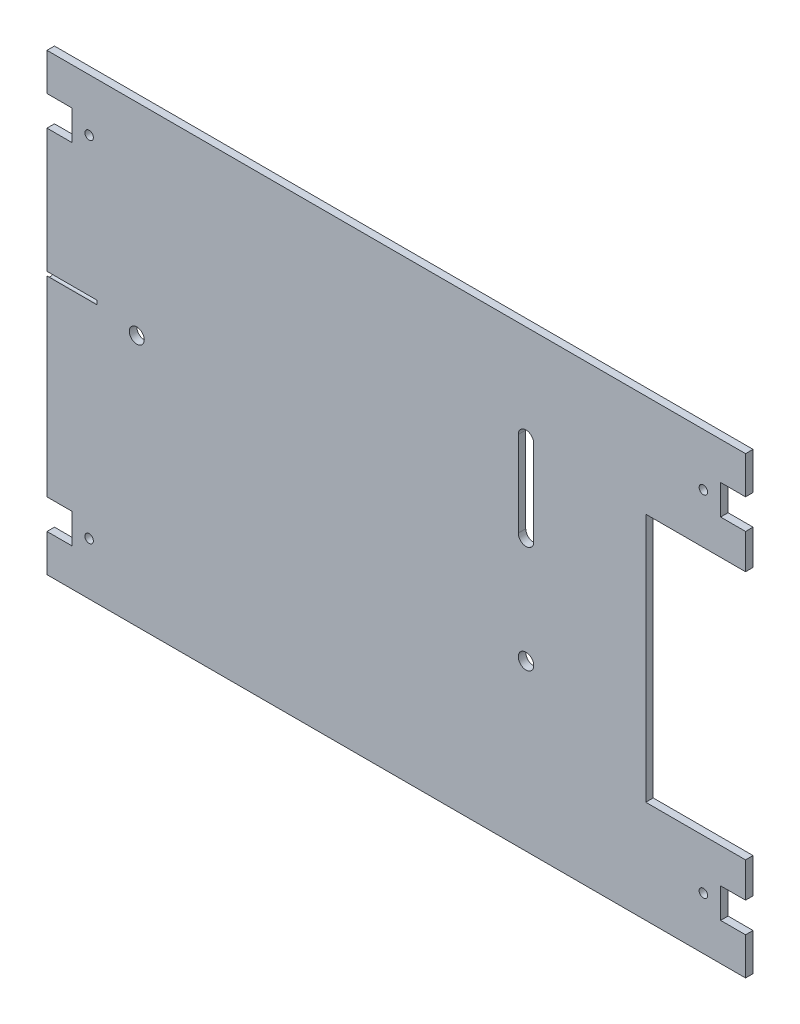
ISO-10303-21;
HEADER;
FILE_DESCRIPTION(('STEP AP214'),'2;1');
FILE_NAME('part.step','',(''),(''),'','','');
FILE_SCHEMA(('AUTOMOTIVE_DESIGN { 1 0 10303 214 1 1 1 1 }'));
ENDSEC;
DATA;
#1=APPLICATION_CONTEXT('core data for automotive mechanical design processes');
#2=APPLICATION_PROTOCOL_DEFINITION('international standard','automotive_design',2000,#1);
#3=PRODUCT_CONTEXT('',#1,'mechanical');
#4=PRODUCT('Part','Part','',(#3));
#5=PRODUCT_RELATED_PRODUCT_CATEGORY('part','',(#4));
#6=PRODUCT_DEFINITION_FORMATION('','',#4);
#7=PRODUCT_DEFINITION_CONTEXT('part definition',#1,'design');
#8=PRODUCT_DEFINITION('design','',#6,#7);
#9=PRODUCT_DEFINITION_SHAPE('','',#8);
#10=(LENGTH_UNIT() NAMED_UNIT(*) SI_UNIT(.MILLI.,.METRE.));
#11=(NAMED_UNIT(*) PLANE_ANGLE_UNIT() SI_UNIT($,.RADIAN.));
#12=(NAMED_UNIT(*) SI_UNIT($,.STERADIAN.) SOLID_ANGLE_UNIT());
#13=UNCERTAINTY_MEASURE_WITH_UNIT(LENGTH_MEASURE(1.E-05),#10,'distance_accuracy_value','');
#14=(GEOMETRIC_REPRESENTATION_CONTEXT(3) GLOBAL_UNCERTAINTY_ASSIGNED_CONTEXT((#13)) GLOBAL_UNIT_ASSIGNED_CONTEXT((#10,
#11,#12)) REPRESENTATION_CONTEXT('',''));
#15=CARTESIAN_POINT('',(0.,0.,0.));
#16=DIRECTION('',(0.,0.,1.));
#17=DIRECTION('',(1.,0.,0.));
#18=AXIS2_PLACEMENT_3D('',#15,#16,#17);
#19=CARTESIAN_POINT('',(0.,0.,1.5));
#20=DIRECTION('',(1.,0.,0.));
#21=DIRECTION('',(0.,1.,0.));
#22=AXIS2_PLACEMENT_3D('',#19,#20,#21);
#23=PLANE('',#22);
#24=DIRECTION('',(0.,-1.,0.));
#25=VECTOR('',#24,1.);
#26=CARTESIAN_POINT('',(0.,0.,1.5));
#27=LINE('',#26,#25);
#28=CARTESIAN_POINT('',(0.,-39.15,1.5));
#29=VERTEX_POINT('',#28);
#30=CARTESIAN_POINT('',(0.,-77.5,1.5));
#31=VERTEX_POINT('',#30);
#32=EDGE_CURVE('E462',#29,#31,#27,.T.);
#33=ORIENTED_EDGE('',*,*,#32,.F.);
#34=CARTESIAN_POINT('',(0.,-38.75,0.750000000000005));
#35=DIRECTION('',(1.,0.,0.));
#36=DIRECTION('',(0.,1.,0.));
#37=AXIS2_PLACEMENT_3D('',#34,#35,#36);
#38=CIRCLE('',#37,0.850000000000005);
#39=CARTESIAN_POINT('',(0.,-39.15,0.));
#40=VERTEX_POINT('',#39);
#41=EDGE_CURVE('E45',#29,#40,#38,.T.);
#42=ORIENTED_EDGE('',*,*,#41,.T.);
#43=DIRECTION('',(0.,-1.,0.));
#44=VECTOR('',#43,1.);
#45=CARTESIAN_POINT('',(0.,0.,0.));
#46=LINE('',#45,#44);
#47=CARTESIAN_POINT('',(0.,-77.5,0.));
#48=VERTEX_POINT('',#47);
#49=EDGE_CURVE('E487',#40,#48,#46,.T.);
#50=ORIENTED_EDGE('',*,*,#49,.T.);
#51=DIRECTION('',(0.,0.,1.));
#52=VECTOR('',#51,1.);
#53=CARTESIAN_POINT('',(0.,-77.5,0.));
#54=LINE('',#53,#52);
#55=EDGE_CURVE('E386',#48,#31,#54,.T.);
#56=ORIENTED_EDGE('',*,*,#55,.T.);
#57=EDGE_LOOP('',(#33,#42,#50,#56));
#58=FACE_BOUND('',#57,.T.);
#59=ADVANCED_FACE('F37',(#58),#23,.F.);
#60=CARTESIAN_POINT('',(0.,0.,1.5));
#61=DIRECTION('',(0.,0.,1.));
#62=DIRECTION('',(1.,0.,0.));
#63=AXIS2_PLACEMENT_3D('',#60,#61,#62);
#64=PLANE('',#63);
#65=DIRECTION('',(-1.,0.,0.));
#66=VECTOR('',#65,1.);
#67=CARTESIAN_POINT('',(10.,-38.35,1.5));
#68=LINE('',#67,#66);
#69=CARTESIAN_POINT('',(10.,-38.35,1.5));
#70=VERTEX_POINT('',#69);
#71=CARTESIAN_POINT('',(0.,-38.35,1.5));
#72=VERTEX_POINT('',#71);
#73=EDGE_CURVE('E52',#70,#72,#68,.T.);
#74=ORIENTED_EDGE('',*,*,#73,.F.);
#75=DIRECTION('',(0.,-1.,0.));
#76=VECTOR('',#75,1.);
#77=CARTESIAN_POINT('',(10.,0.,1.5));
#78=LINE('',#77,#76);
#79=CARTESIAN_POINT('',(10.,-39.15,1.5));
#80=VERTEX_POINT('',#79);
#81=EDGE_CURVE('E260',#70,#80,#78,.T.);
#82=ORIENTED_EDGE('',*,*,#81,.T.);
#83=DIRECTION('',(-1.,0.,0.));
#84=VECTOR('',#83,1.);
#85=CARTESIAN_POINT('',(10.,-39.15,1.5));
#86=LINE('',#85,#84);
#87=EDGE_CURVE('E246',#29,#80,#86,.F.);
#88=ORIENTED_EDGE('',*,*,#87,.F.);
#89=ORIENTED_EDGE('',*,*,#32,.T.);
#90=DIRECTION('',(1.,0.,0.));
#91=VECTOR('',#90,1.);
#92=CARTESIAN_POINT('',(-4.30211422042248E-13,-77.5,1.5));
#93=LINE('',#92,#91);
#94=CARTESIAN_POINT('',(5.,-77.5,1.5));
#95=VERTEX_POINT('',#94);
#96=EDGE_CURVE('E373',#31,#95,#93,.T.);
#97=ORIENTED_EDGE('',*,*,#96,.T.);
#98=DIRECTION('',(0.,1.,0.));
#99=VECTOR('',#98,1.);
#100=CARTESIAN_POINT('',(5.,0.,1.5));
#101=LINE('',#100,#99);
#102=CARTESIAN_POINT('',(5.,-83.5,1.5));
#103=VERTEX_POINT('',#102);
#104=EDGE_CURVE('E381',#103,#95,#101,.T.);
#105=ORIENTED_EDGE('',*,*,#104,.F.);
#106=DIRECTION('',(1.,0.,0.));
#107=VECTOR('',#106,1.);
#108=CARTESIAN_POINT('',(2.31759056390501E-13,-83.5,1.5));
#109=LINE('',#108,#107);
#110=CARTESIAN_POINT('',(0.,-83.5,1.5));
#111=VERTEX_POINT('',#110);
#112=EDGE_CURVE('E341',#111,#103,#109,.T.);
#113=ORIENTED_EDGE('',*,*,#112,.F.);
#114=CARTESIAN_POINT('',(0.,-91.,1.5));
#115=VERTEX_POINT('',#114);
#116=EDGE_CURVE('E456',#111,#115,#27,.T.);
#117=ORIENTED_EDGE('',*,*,#116,.T.);
#118=DIRECTION('',(1.,0.,0.));
#119=VECTOR('',#118,1.);
#120=CARTESIAN_POINT('',(0.,-91.,1.5));
#121=LINE('',#120,#119);
#122=CARTESIAN_POINT('',(140.,-91.,1.5));
#123=VERTEX_POINT('',#122);
#124=EDGE_CURVE('E460',#115,#123,#121,.T.);
#125=ORIENTED_EDGE('',*,*,#124,.T.);
#126=DIRECTION('',(0.,-1.,0.));
#127=VECTOR('',#126,1.);
#128=CARTESIAN_POINT('',(140.,0.,1.5));
#129=LINE('',#128,#127);
#130=CARTESIAN_POINT('',(140.,-83.5,1.5));
#131=VERTEX_POINT('',#130);
#132=EDGE_CURVE('E465',#131,#123,#129,.T.);
#133=ORIENTED_EDGE('',*,*,#132,.F.);
#134=DIRECTION('',(-1.,0.,0.));
#135=VECTOR('',#134,1.);
#136=CARTESIAN_POINT('',(-4.63518112780998E-13,-83.4999999999992,1.5));
#137=LINE('',#136,#135);
#138=CARTESIAN_POINT('',(135.,-83.5,1.5));
#139=VERTEX_POINT('',#138);
#140=EDGE_CURVE('E270',#131,#139,#137,.T.);
#141=ORIENTED_EDGE('',*,*,#140,.T.);
#142=DIRECTION('',(0.,1.,0.));
#143=VECTOR('',#142,1.);
#144=CARTESIAN_POINT('',(135.,0.,1.5));
#145=LINE('',#144,#143);
#146=CARTESIAN_POINT('',(135.,-77.5,1.5));
#147=VERTEX_POINT('',#146);
#148=EDGE_CURVE('E267',#139,#147,#145,.T.);
#149=ORIENTED_EDGE('',*,*,#148,.T.);
#150=DIRECTION('',(-1.,0.,0.));
#151=VECTOR('',#150,1.);
#152=CARTESIAN_POINT('',(4.30211422042252E-13,-77.5000000000008,1.5));
#153=LINE('',#152,#151);
#154=CARTESIAN_POINT('',(140.,-77.5,1.5));
#155=VERTEX_POINT('',#154);
#156=EDGE_CURVE('E291',#155,#147,#153,.T.);
#157=ORIENTED_EDGE('',*,*,#156,.F.);
#158=CARTESIAN_POINT('',(140.,-70.5,1.5));
#159=VERTEX_POINT('',#158);
#160=EDGE_CURVE('E453',#159,#155,#129,.T.);
#161=ORIENTED_EDGE('',*,*,#160,.F.);
#162=DIRECTION('',(1.,0.,0.));
#163=VECTOR('',#162,1.);
#164=CARTESIAN_POINT('',(0.,-70.5,1.5));
#165=LINE('',#164,#163);
#166=CARTESIAN_POINT('',(120.,-70.5,1.5));
#167=VERTEX_POINT('',#166);
#168=EDGE_CURVE('E438',#167,#159,#165,.T.);
#169=ORIENTED_EDGE('',*,*,#168,.F.);
#170=DIRECTION('',(0.,-1.,0.));
#171=VECTOR('',#170,1.);
#172=CARTESIAN_POINT('',(120.,0.,1.5));
#173=LINE('',#172,#171);
#174=CARTESIAN_POINT('',(120.,-20.5,1.5));
#175=VERTEX_POINT('',#174);
#176=EDGE_CURVE('E441',#175,#167,#173,.T.);
#177=ORIENTED_EDGE('',*,*,#176,.F.);
#178=DIRECTION('',(1.,0.,0.));
#179=VECTOR('',#178,1.);
#180=CARTESIAN_POINT('',(0.,-20.5,1.5));
#181=LINE('',#180,#179);
#182=CARTESIAN_POINT('',(140.,-20.5,1.5));
#183=VERTEX_POINT('',#182);
#184=EDGE_CURVE('E445',#175,#183,#181,.T.);
#185=ORIENTED_EDGE('',*,*,#184,.T.);
#186=CARTESIAN_POINT('',(140.,-13.5,1.5));
#187=VERTEX_POINT('',#186);
#188=EDGE_CURVE('E448',#187,#183,#129,.T.);
#189=ORIENTED_EDGE('',*,*,#188,.F.);
#190=DIRECTION('',(-1.,0.,0.));
#191=VECTOR('',#190,1.);
#192=CARTESIAN_POINT('',(0.,-13.4999999999992,1.5));
#193=LINE('',#192,#191);
#194=CARTESIAN_POINT('',(135.,-13.5,1.5));
#195=VERTEX_POINT('',#194);
#196=EDGE_CURVE('E318',#187,#195,#193,.T.);
#197=ORIENTED_EDGE('',*,*,#196,.T.);
#198=DIRECTION('',(0.,-1.,0.));
#199=VECTOR('',#198,1.);
#200=CARTESIAN_POINT('',(135.,0.,1.5));
#201=LINE('',#200,#199);
#202=CARTESIAN_POINT('',(135.,-7.50000000000003,1.5));
#203=VERTEX_POINT('',#202);
#204=EDGE_CURVE('E326',#203,#195,#201,.T.);
#205=ORIENTED_EDGE('',*,*,#204,.F.);
#206=DIRECTION('',(-1.,0.,0.));
#207=VECTOR('',#206,1.);
#208=CARTESIAN_POINT('',(0.,-7.50000000000078,1.5));
#209=LINE('',#208,#207);
#210=CARTESIAN_POINT('',(140.,-7.50000000000001,1.5));
#211=VERTEX_POINT('',#210);
#212=EDGE_CURVE('E277',#211,#203,#209,.T.);
#213=ORIENTED_EDGE('',*,*,#212,.F.);
#214=CARTESIAN_POINT('',(140.,0.,1.5));
#215=VERTEX_POINT('',#214);
#216=EDGE_CURVE('E449',#215,#211,#129,.T.);
#217=ORIENTED_EDGE('',*,*,#216,.F.);
#218=DIRECTION('',(1.,0.,0.));
#219=VECTOR('',#218,1.);
#220=CARTESIAN_POINT('',(0.,0.,1.5));
#221=LINE('',#220,#219);
#222=CARTESIAN_POINT('',(0.,0.,1.5));
#223=VERTEX_POINT('',#222);
#224=EDGE_CURVE('E452',#223,#215,#221,.T.);
#225=ORIENTED_EDGE('',*,*,#224,.F.);
#226=CARTESIAN_POINT('',(0.,-7.5,1.5));
#227=VERTEX_POINT('',#226);
#228=EDGE_CURVE('E457',#223,#227,#27,.T.);
#229=ORIENTED_EDGE('',*,*,#228,.T.);
#230=DIRECTION('',(1.,0.,0.));
#231=VECTOR('',#230,1.);
#232=CARTESIAN_POINT('',(0.,-7.49999999999998,1.5));
#233=LINE('',#232,#231);
#234=CARTESIAN_POINT('',(5.,-7.50000000000002,1.5));
#235=VERTEX_POINT('',#234);
#236=EDGE_CURVE('E357',#227,#235,#233,.T.);
#237=ORIENTED_EDGE('',*,*,#236,.T.);
#238=DIRECTION('',(0.,-1.,0.));
#239=VECTOR('',#238,1.);
#240=CARTESIAN_POINT('',(5.,0.,1.5));
#241=LINE('',#240,#239);
#242=CARTESIAN_POINT('',(5.,-13.5,1.5));
#243=VERTEX_POINT('',#242);
#244=EDGE_CURVE('E311',#235,#243,#241,.T.);
#245=ORIENTED_EDGE('',*,*,#244,.T.);
#246=DIRECTION('',(1.,0.,0.));
#247=VECTOR('',#246,1.);
#248=CARTESIAN_POINT('',(0.,-13.5,1.5));
#249=LINE('',#248,#247);
#250=CARTESIAN_POINT('',(0.,-13.5,1.5));
#251=VERTEX_POINT('',#250);
#252=EDGE_CURVE('E349',#251,#243,#249,.T.);
#253=ORIENTED_EDGE('',*,*,#252,.F.);
#254=EDGE_CURVE('E461',#251,#72,#27,.T.);
#255=ORIENTED_EDGE('',*,*,#254,.T.);
#256=EDGE_LOOP('',(#74,#82,#88,#89,#97,#105,#113,#117,#125,#133,#141,#149,#157,#161,#169,#177,
#185,#189,#197,#205,#213,#217,#225,#229,#237,#245,#253,#255));
#257=FACE_BOUND('',#256,.T.);
#258=CARTESIAN_POINT('',(8.45,-10.5,1.5));
#259=DIRECTION('',(0.,0.,1.));
#260=DIRECTION('',(1.,0.,0.));
#261=AXIS2_PLACEMENT_3D('',#258,#259,#260);
#262=CIRCLE('',#261,0.85);
#263=CARTESIAN_POINT('',(9.3,-10.5,1.5));
#264=VERTEX_POINT('',#263);
#265=EDGE_CURVE('E312',#264,#264,#262,.T.);
#266=ORIENTED_EDGE('',*,*,#265,.F.);
#267=EDGE_LOOP('',(#266));
#268=FACE_BOUND('',#267,.T.);
#269=CARTESIAN_POINT('',(131.55,-10.5,1.5));
#270=DIRECTION('',(0.,0.,1.));
#271=DIRECTION('',(1.,0.,0.));
#272=AXIS2_PLACEMENT_3D('',#269,#270,#271);
#273=CIRCLE('',#272,0.850000000000008);
#274=CARTESIAN_POINT('',(132.4,-10.5,1.5));
#275=VERTEX_POINT('',#274);
#276=EDGE_CURVE('E278',#275,#275,#273,.F.);
#277=ORIENTED_EDGE('',*,*,#276,.T.);
#278=EDGE_LOOP('',(#277));
#279=FACE_BOUND('',#278,.T.);
#280=CARTESIAN_POINT('',(131.55,-80.5,1.5));
#281=DIRECTION('',(0.,0.,1.));
#282=DIRECTION('',(1.,0.,0.));
#283=AXIS2_PLACEMENT_3D('',#280,#281,#282);
#284=CIRCLE('',#283,0.850000000000007);
#285=CARTESIAN_POINT('',(132.4,-80.5,1.5));
#286=VERTEX_POINT('',#285);
#287=EDGE_CURVE('E284',#286,#286,#284,.T.);
#288=ORIENTED_EDGE('',*,*,#287,.F.);
#289=EDGE_LOOP('',(#288));
#290=FACE_BOUND('',#289,.T.);
#291=CARTESIAN_POINT('',(18.,-40.5,1.5));
#292=DIRECTION('',(0.,0.,1.));
#293=DIRECTION('',(1.,0.,0.));
#294=AXIS2_PLACEMENT_3D('',#291,#292,#293);
#295=CIRCLE('',#294,1.5);
#296=CARTESIAN_POINT('',(19.5,-40.5,1.5));
#297=VERTEX_POINT('',#296);
#298=EDGE_CURVE('E409',#297,#297,#295,.T.);
#299=ORIENTED_EDGE('',*,*,#298,.F.);
#300=EDGE_LOOP('',(#299));
#301=FACE_BOUND('',#300,.T.);
#302=CARTESIAN_POINT('',(96.,-58.,1.5));
#303=DIRECTION('',(0.,0.,1.));
#304=DIRECTION('',(1.,0.,0.));
#305=AXIS2_PLACEMENT_3D('',#302,#303,#304);
#306=CIRCLE('',#305,1.54999999999999);
#307=CARTESIAN_POINT('',(97.55,-58.,1.5));
#308=VERTEX_POINT('',#307);
#309=EDGE_CURVE('E431',#308,#308,#306,.T.);
#310=ORIENTED_EDGE('',*,*,#309,.F.);
#311=EDGE_LOOP('',(#310));
#312=FACE_BOUND('',#311,.T.);
#313=CARTESIAN_POINT('',(96.,-19.4399083358824,1.5));
#314=DIRECTION('',(0.,0.,1.));
#315=DIRECTION('',(1.,0.,0.));
#316=AXIS2_PLACEMENT_3D('',#313,#314,#315);
#317=CIRCLE('',#316,1.54999999999997);
#318=CARTESIAN_POINT('',(97.55,-19.4399083358824,1.5));
#319=VERTEX_POINT('',#318);
#320=CARTESIAN_POINT('',(94.45,-19.4399083358824,1.5));
#321=VERTEX_POINT('',#320);
#322=EDGE_CURVE('E415',#319,#321,#317,.T.);
#323=ORIENTED_EDGE('',*,*,#322,.F.);
#324=DIRECTION('',(0.,-1.,0.));
#325=VECTOR('',#324,1.);
#326=CARTESIAN_POINT('',(97.55,-19.4399083358824,1.5));
#327=LINE('',#326,#325);
#328=CARTESIAN_POINT('',(97.55,-36.5600916641176,1.5));
#329=VERTEX_POINT('',#328);
#330=EDGE_CURVE('E405',#319,#329,#327,.T.);
#331=ORIENTED_EDGE('',*,*,#330,.T.);
#332=CARTESIAN_POINT('',(96.,-36.5600916641176,1.5));
#333=DIRECTION('',(0.,0.,1.));
#334=DIRECTION('',(1.,0.,0.));
#335=AXIS2_PLACEMENT_3D('',#332,#333,#334);
#336=CIRCLE('',#335,1.55);
#337=CARTESIAN_POINT('',(94.45,-36.5600916641176,1.5));
#338=VERTEX_POINT('',#337);
#339=EDGE_CURVE('E408',#338,#329,#336,.T.);
#340=ORIENTED_EDGE('',*,*,#339,.F.);
#341=DIRECTION('',(0.,-1.,0.));
#342=VECTOR('',#341,1.);
#343=CARTESIAN_POINT('',(94.45,-19.4399083358824,1.5));
#344=LINE('',#343,#342);
#345=EDGE_CURVE('E412',#321,#338,#344,.T.);
#346=ORIENTED_EDGE('',*,*,#345,.F.);
#347=EDGE_LOOP('',(#323,#331,#340,#346));
#348=FACE_BOUND('',#347,.T.);
#349=CARTESIAN_POINT('',(8.45,-80.5,1.5));
#350=DIRECTION('',(0.,0.,1.));
#351=DIRECTION('',(1.,0.,0.));
#352=AXIS2_PLACEMENT_3D('',#349,#350,#351);
#353=CIRCLE('',#352,0.850000000000001);
#354=CARTESIAN_POINT('',(9.3,-80.5,1.5));
#355=VERTEX_POINT('',#354);
#356=EDGE_CURVE('E342',#355,#355,#353,.F.);
#357=ORIENTED_EDGE('',*,*,#356,.T.);
#358=EDGE_LOOP('',(#357));
#359=FACE_BOUND('',#358,.T.);
#360=ADVANCED_FACE('F264',(#257,#268,#279,#290,#301,#312,#348,#359),#64,.T.);
#361=CARTESIAN_POINT('',(0.,0.,0.));
#362=DIRECTION('',(0.,0.,1.));
#363=DIRECTION('',(1.,0.,0.));
#364=AXIS2_PLACEMENT_3D('',#361,#362,#363);
#365=PLANE('',#364);
#366=CARTESIAN_POINT('',(8.45,-80.5,0.));
#367=DIRECTION('',(0.,0.,1.));
#368=DIRECTION('',(1.,0.,0.));
#369=AXIS2_PLACEMENT_3D('',#366,#367,#368);
#370=CIRCLE('',#369,0.850000000000001);
#371=CARTESIAN_POINT('',(9.3,-80.5,0.));
#372=VERTEX_POINT('',#371);
#373=EDGE_CURVE('E338',#372,#372,#370,.F.);
#374=ORIENTED_EDGE('',*,*,#373,.F.);
#375=EDGE_LOOP('',(#374));
#376=FACE_BOUND('',#375,.T.);
#377=CARTESIAN_POINT('',(131.55,-10.5,0.));
#378=DIRECTION('',(0.,0.,1.));
#379=DIRECTION('',(1.,0.,0.));
#380=AXIS2_PLACEMENT_3D('',#377,#378,#379);
#381=CIRCLE('',#380,0.850000000000008);
#382=CARTESIAN_POINT('',(132.4,-10.5,0.));
#383=VERTEX_POINT('',#382);
#384=EDGE_CURVE('E274',#383,#383,#381,.F.);
#385=ORIENTED_EDGE('',*,*,#384,.F.);
#386=EDGE_LOOP('',(#385));
#387=FACE_BOUND('',#386,.T.);
#388=CARTESIAN_POINT('',(96.,-58.,0.));
#389=DIRECTION('',(0.,0.,1.));
#390=DIRECTION('',(1.,0.,0.));
#391=AXIS2_PLACEMENT_3D('',#388,#389,#390);
#392=CIRCLE('',#391,1.54999999999999);
#393=CARTESIAN_POINT('',(97.55,-58.,0.));
#394=VERTEX_POINT('',#393);
#395=EDGE_CURVE('E389',#394,#394,#392,.F.);
#396=ORIENTED_EDGE('',*,*,#395,.F.);
#397=EDGE_LOOP('',(#396));
#398=FACE_BOUND('',#397,.T.);
#399=CARTESIAN_POINT('',(18.,-40.5,0.));
#400=DIRECTION('',(0.,0.,1.));
#401=DIRECTION('',(1.,0.,0.));
#402=AXIS2_PLACEMENT_3D('',#399,#400,#401);
#403=CIRCLE('',#402,1.5);
#404=CARTESIAN_POINT('',(19.5,-40.5,0.));
#405=VERTEX_POINT('',#404);
#406=EDGE_CURVE('E428',#405,#405,#403,.F.);
#407=ORIENTED_EDGE('',*,*,#406,.F.);
#408=EDGE_LOOP('',(#407));
#409=FACE_BOUND('',#408,.T.);
#410=DIRECTION('',(0.,1.,0.));
#411=VECTOR('',#410,1.);
#412=CARTESIAN_POINT('',(97.55,-19.4399083358824,0.));
#413=LINE('',#412,#411);
#414=CARTESIAN_POINT('',(97.55,-36.5600916641176,0.));
#415=VERTEX_POINT('',#414);
#416=CARTESIAN_POINT('',(97.55,-19.4399083358824,0.));
#417=VERTEX_POINT('',#416);
#418=EDGE_CURVE('E401',#415,#417,#413,.T.);
#419=ORIENTED_EDGE('',*,*,#418,.T.);
#420=CARTESIAN_POINT('',(96.,-19.4399083358824,0.));
#421=DIRECTION('',(0.,0.,1.));
#422=DIRECTION('',(1.,0.,0.));
#423=AXIS2_PLACEMENT_3D('',#420,#421,#422);
#424=CIRCLE('',#423,1.54999999999997);
#425=CARTESIAN_POINT('',(94.45,-19.4399083358824,0.));
#426=VERTEX_POINT('',#425);
#427=EDGE_CURVE('E404',#426,#417,#424,.F.);
#428=ORIENTED_EDGE('',*,*,#427,.F.);
#429=DIRECTION('',(0.,1.,0.));
#430=VECTOR('',#429,1.);
#431=CARTESIAN_POINT('',(94.45,-19.4399083358824,0.));
#432=LINE('',#431,#430);
#433=CARTESIAN_POINT('',(94.45,-36.5600916641176,0.));
#434=VERTEX_POINT('',#433);
#435=EDGE_CURVE('E395',#434,#426,#432,.T.);
#436=ORIENTED_EDGE('',*,*,#435,.F.);
#437=CARTESIAN_POINT('',(96.,-36.5600916641176,0.));
#438=DIRECTION('',(0.,0.,1.));
#439=DIRECTION('',(1.,0.,0.));
#440=AXIS2_PLACEMENT_3D('',#437,#438,#439);
#441=CIRCLE('',#440,1.55);
#442=EDGE_CURVE('E398',#415,#434,#441,.F.);
#443=ORIENTED_EDGE('',*,*,#442,.F.);
#444=EDGE_LOOP('',(#419,#428,#436,#443));
#445=FACE_BOUND('',#444,.T.);
#446=CARTESIAN_POINT('',(131.55,-80.5,0.));
#447=DIRECTION('',(0.,0.,1.));
#448=DIRECTION('',(1.,0.,0.));
#449=AXIS2_PLACEMENT_3D('',#446,#447,#448);
#450=CIRCLE('',#449,0.850000000000007);
#451=CARTESIAN_POINT('',(132.4,-80.5,0.));
#452=VERTEX_POINT('',#451);
#453=EDGE_CURVE('E281',#452,#452,#450,.T.);
#454=ORIENTED_EDGE('',*,*,#453,.T.);
#455=EDGE_LOOP('',(#454));
#456=FACE_BOUND('',#455,.T.);
#457=CARTESIAN_POINT('',(8.45,-10.5,0.));
#458=DIRECTION('',(0.,0.,1.));
#459=DIRECTION('',(1.,0.,0.));
#460=AXIS2_PLACEMENT_3D('',#457,#458,#459);
#461=CIRCLE('',#460,0.85);
#462=CARTESIAN_POINT('',(9.3,-10.5,0.));
#463=VERTEX_POINT('',#462);
#464=EDGE_CURVE('E308',#463,#463,#461,.T.);
#465=ORIENTED_EDGE('',*,*,#464,.T.);
#466=EDGE_LOOP('',(#465));
#467=FACE_BOUND('',#466,.T.);
#468=DIRECTION('',(0.,-1.,0.));
#469=VECTOR('',#468,1.);
#470=CARTESIAN_POINT('',(10.,0.,0.));
#471=LINE('',#470,#469);
#472=CARTESIAN_POINT('',(10.,-38.35,0.));
#473=VERTEX_POINT('',#472);
#474=CARTESIAN_POINT('',(10.,-39.15,0.));
#475=VERTEX_POINT('',#474);
#476=EDGE_CURVE('E11',#473,#475,#471,.T.);
#477=ORIENTED_EDGE('',*,*,#476,.F.);
#478=DIRECTION('',(-1.,0.,0.));
#479=VECTOR('',#478,1.);
#480=CARTESIAN_POINT('',(10.,-38.35,0.));
#481=LINE('',#480,#479);
#482=CARTESIAN_POINT('',(0.,-38.35,0.));
#483=VERTEX_POINT('',#482);
#484=EDGE_CURVE('E255',#473,#483,#481,.T.);
#485=ORIENTED_EDGE('',*,*,#484,.T.);
#486=CARTESIAN_POINT('',(0.,-13.5,0.));
#487=VERTEX_POINT('',#486);
#488=EDGE_CURVE('E486',#487,#483,#46,.T.);
#489=ORIENTED_EDGE('',*,*,#488,.F.);
#490=DIRECTION('',(1.,0.,0.));
#491=VECTOR('',#490,1.);
#492=CARTESIAN_POINT('',(0.,-13.5,0.));
#493=LINE('',#492,#491);
#494=CARTESIAN_POINT('',(5.,-13.5,0.));
#495=VERTEX_POINT('',#494);
#496=EDGE_CURVE('E351',#487,#495,#493,.T.);
#497=ORIENTED_EDGE('',*,*,#496,.T.);
#498=DIRECTION('',(0.,-1.,0.));
#499=VECTOR('',#498,1.);
#500=CARTESIAN_POINT('',(5.,0.,0.));
#501=LINE('',#500,#499);
#502=CARTESIAN_POINT('',(5.,-7.50000000000002,0.));
#503=VERTEX_POINT('',#502);
#504=EDGE_CURVE('E346',#503,#495,#501,.T.);
#505=ORIENTED_EDGE('',*,*,#504,.F.);
#506=DIRECTION('',(1.,0.,0.));
#507=VECTOR('',#506,1.);
#508=CARTESIAN_POINT('',(0.,-7.49999999999998,0.));
#509=LINE('',#508,#507);
#510=CARTESIAN_POINT('',(0.,-7.5,0.));
#511=VERTEX_POINT('',#510);
#512=EDGE_CURVE('E348',#511,#503,#509,.T.);
#513=ORIENTED_EDGE('',*,*,#512,.F.);
#514=CARTESIAN_POINT('',(0.,0.,0.));
#515=VERTEX_POINT('',#514);
#516=EDGE_CURVE('E482',#515,#511,#46,.T.);
#517=ORIENTED_EDGE('',*,*,#516,.F.);
#518=DIRECTION('',(1.,0.,0.));
#519=VECTOR('',#518,1.);
#520=CARTESIAN_POINT('',(0.,0.,0.));
#521=LINE('',#520,#519);
#522=CARTESIAN_POINT('',(140.,0.,0.));
#523=VERTEX_POINT('',#522);
#524=EDGE_CURVE('E478',#515,#523,#521,.T.);
#525=ORIENTED_EDGE('',*,*,#524,.T.);
#526=DIRECTION('',(0.,-1.,0.));
#527=VECTOR('',#526,1.);
#528=CARTESIAN_POINT('',(140.,0.,0.));
#529=LINE('',#528,#527);
#530=CARTESIAN_POINT('',(140.,-7.50000000000001,0.));
#531=VERTEX_POINT('',#530);
#532=EDGE_CURVE('E475',#523,#531,#529,.T.);
#533=ORIENTED_EDGE('',*,*,#532,.T.);
#534=DIRECTION('',(-1.,0.,0.));
#535=VECTOR('',#534,1.);
#536=CARTESIAN_POINT('',(0.,-7.50000000000078,0.));
#537=LINE('',#536,#535);
#538=CARTESIAN_POINT('',(135.,-7.50000000000003,0.));
#539=VERTEX_POINT('',#538);
#540=EDGE_CURVE('E60',#531,#539,#537,.T.);
#541=ORIENTED_EDGE('',*,*,#540,.T.);
#542=DIRECTION('',(0.,-1.,0.));
#543=VECTOR('',#542,1.);
#544=CARTESIAN_POINT('',(135.,0.,0.));
#545=LINE('',#544,#543);
#546=CARTESIAN_POINT('',(135.,-13.5,0.));
#547=VERTEX_POINT('',#546);
#548=EDGE_CURVE('E317',#539,#547,#545,.T.);
#549=ORIENTED_EDGE('',*,*,#548,.T.);
#550=DIRECTION('',(-1.,0.,0.));
#551=VECTOR('',#550,1.);
#552=CARTESIAN_POINT('',(0.,-13.4999999999992,0.));
#553=LINE('',#552,#551);
#554=CARTESIAN_POINT('',(140.,-13.5,0.));
#555=VERTEX_POINT('',#554);
#556=EDGE_CURVE('E321',#555,#547,#553,.T.);
#557=ORIENTED_EDGE('',*,*,#556,.F.);
#558=CARTESIAN_POINT('',(140.,-20.5,0.));
#559=VERTEX_POINT('',#558);
#560=EDGE_CURVE('E474',#555,#559,#529,.T.);
#561=ORIENTED_EDGE('',*,*,#560,.T.);
#562=DIRECTION('',(1.,0.,0.));
#563=VECTOR('',#562,1.);
#564=CARTESIAN_POINT('',(0.,-20.5,0.));
#565=LINE('',#564,#563);
#566=CARTESIAN_POINT('',(120.,-20.5,0.));
#567=VERTEX_POINT('',#566);
#568=EDGE_CURVE('E471',#567,#559,#565,.T.);
#569=ORIENTED_EDGE('',*,*,#568,.F.);
#570=DIRECTION('',(0.,-1.,0.));
#571=VECTOR('',#570,1.);
#572=CARTESIAN_POINT('',(120.,0.,0.));
#573=LINE('',#572,#571);
#574=CARTESIAN_POINT('',(120.,-70.5,0.));
#575=VERTEX_POINT('',#574);
#576=EDGE_CURVE('E468',#567,#575,#573,.T.);
#577=ORIENTED_EDGE('',*,*,#576,.T.);
#578=DIRECTION('',(1.,0.,0.));
#579=VECTOR('',#578,1.);
#580=CARTESIAN_POINT('',(0.,-70.5,0.));
#581=LINE('',#580,#579);
#582=CARTESIAN_POINT('',(140.,-70.5,0.));
#583=VERTEX_POINT('',#582);
#584=EDGE_CURVE('E427',#575,#583,#581,.T.);
#585=ORIENTED_EDGE('',*,*,#584,.T.);
#586=CARTESIAN_POINT('',(140.,-77.5,0.));
#587=VERTEX_POINT('',#586);
#588=EDGE_CURVE('E442',#583,#587,#529,.T.);
#589=ORIENTED_EDGE('',*,*,#588,.T.);
#590=DIRECTION('',(-1.,0.,0.));
#591=VECTOR('',#590,1.);
#592=CARTESIAN_POINT('',(4.30211422042252E-13,-77.5000000000008,0.));
#593=LINE('',#592,#591);
#594=CARTESIAN_POINT('',(135.,-77.5,0.));
#595=VERTEX_POINT('',#594);
#596=EDGE_CURVE('E293',#587,#595,#593,.T.);
#597=ORIENTED_EDGE('',*,*,#596,.T.);
#598=DIRECTION('',(0.,1.,0.));
#599=VECTOR('',#598,1.);
#600=CARTESIAN_POINT('',(135.,0.,0.));
#601=LINE('',#600,#599);
#602=CARTESIAN_POINT('',(135.,-83.5,0.));
#603=VERTEX_POINT('',#602);
#604=EDGE_CURVE('E288',#603,#595,#601,.T.);
#605=ORIENTED_EDGE('',*,*,#604,.F.);
#606=DIRECTION('',(-1.,0.,0.));
#607=VECTOR('',#606,1.);
#608=CARTESIAN_POINT('',(-4.63518112780998E-13,-83.4999999999992,0.));
#609=LINE('',#608,#607);
#610=CARTESIAN_POINT('',(140.,-83.5,0.));
#611=VERTEX_POINT('',#610);
#612=EDGE_CURVE('E290',#611,#603,#609,.T.);
#613=ORIENTED_EDGE('',*,*,#612,.F.);
#614=CARTESIAN_POINT('',(140.,-91.,0.));
#615=VERTEX_POINT('',#614);
#616=EDGE_CURVE('E490',#611,#615,#529,.T.);
#617=ORIENTED_EDGE('',*,*,#616,.T.);
#618=DIRECTION('',(1.,0.,0.));
#619=VECTOR('',#618,1.);
#620=CARTESIAN_POINT('',(0.,-91.,0.));
#621=LINE('',#620,#619);
#622=CARTESIAN_POINT('',(0.,-91.,0.));
#623=VERTEX_POINT('',#622);
#624=EDGE_CURVE('E485',#623,#615,#621,.T.);
#625=ORIENTED_EDGE('',*,*,#624,.F.);
#626=CARTESIAN_POINT('',(0.,-83.5,0.));
#627=VERTEX_POINT('',#626);
#628=EDGE_CURVE('E481',#627,#623,#46,.T.);
#629=ORIENTED_EDGE('',*,*,#628,.F.);
#630=DIRECTION('',(1.,0.,0.));
#631=VECTOR('',#630,1.);
#632=CARTESIAN_POINT('',(2.31759056390501E-13,-83.5,0.));
#633=LINE('',#632,#631);
#634=CARTESIAN_POINT('',(5.,-83.5,0.));
#635=VERTEX_POINT('',#634);
#636=EDGE_CURVE('E369',#627,#635,#633,.T.);
#637=ORIENTED_EDGE('',*,*,#636,.T.);
#638=DIRECTION('',(0.,1.,0.));
#639=VECTOR('',#638,1.);
#640=CARTESIAN_POINT('',(5.,0.,0.));
#641=LINE('',#640,#639);
#642=CARTESIAN_POINT('',(5.,-77.5,0.));
#643=VERTEX_POINT('',#642);
#644=EDGE_CURVE('E372',#635,#643,#641,.T.);
#645=ORIENTED_EDGE('',*,*,#644,.T.);
#646=DIRECTION('',(1.,0.,0.));
#647=VECTOR('',#646,1.);
#648=CARTESIAN_POINT('',(-4.30211422042248E-13,-77.5,0.));
#649=LINE('',#648,#647);
#650=EDGE_CURVE('E376',#48,#643,#649,.T.);
#651=ORIENTED_EDGE('',*,*,#650,.F.);
#652=ORIENTED_EDGE('',*,*,#49,.F.);
#653=DIRECTION('',(-1.,0.,0.));
#654=VECTOR('',#653,1.);
#655=CARTESIAN_POINT('',(10.,-39.15,0.));
#656=LINE('',#655,#654);
#657=EDGE_CURVE('E519',#40,#475,#656,.F.);
#658=ORIENTED_EDGE('',*,*,#657,.T.);
#659=EDGE_LOOP('',(#477,#485,#489,#497,#505,#513,#517,#525,#533,#541,#549,#557,#561,#569,#577,
#585,#589,#597,#605,#613,#617,#625,#629,#637,#645,#651,#652,#658));
#660=FACE_BOUND('',#659,.T.);
#661=ADVANCED_FACE('F518',(#376,#387,#398,#409,#445,#456,#467,#660),#365,.F.);
#662=CARTESIAN_POINT('',(140.,0.,1.5));
#663=DIRECTION('',(1.,0.,0.));
#664=DIRECTION('',(0.,0.,-1.));
#665=AXIS2_PLACEMENT_3D('',#662,#663,#664);
#666=PLANE('',#665);
#667=ORIENTED_EDGE('',*,*,#560,.F.);
#668=DIRECTION('',(0.,0.,1.));
#669=VECTOR('',#668,1.);
#670=CARTESIAN_POINT('',(140.,-13.5,0.));
#671=LINE('',#670,#669);
#672=EDGE_CURVE('E315',#555,#187,#671,.T.);
#673=ORIENTED_EDGE('',*,*,#672,.T.);
#674=ORIENTED_EDGE('',*,*,#188,.T.);
#675=DIRECTION('',(0.,0.,-1.));
#676=VECTOR('',#675,1.);
#677=CARTESIAN_POINT('',(140.,-20.5,1.5));
#678=LINE('',#677,#676);
#679=EDGE_CURVE('E503',#183,#559,#678,.T.);
#680=ORIENTED_EDGE('',*,*,#679,.T.);
#681=EDGE_LOOP('',(#667,#673,#674,#680));
#682=FACE_BOUND('',#681,.T.);
#683=ADVANCED_FACE('F568',(#682),#666,.T.);
#684=DIRECTION('',(0.,0.,1.));
#685=VECTOR('',#684,1.);
#686=CARTESIAN_POINT('',(0.,-7.5,0.));
#687=LINE('',#686,#685);
#688=EDGE_CURVE('E365',#511,#227,#687,.T.);
#689=ORIENTED_EDGE('',*,*,#688,.T.);
#690=ORIENTED_EDGE('',*,*,#228,.F.);
#691=DIRECTION('',(0.,0.,-1.));
#692=VECTOR('',#691,1.);
#693=CARTESIAN_POINT('',(0.,0.,1.5));
#694=LINE('',#693,#692);
#695=EDGE_CURVE('E499',#223,#515,#694,.T.);
#696=ORIENTED_EDGE('',*,*,#695,.T.);
#697=ORIENTED_EDGE('',*,*,#516,.T.);
#698=EDGE_LOOP('',(#689,#690,#696,#697));
#699=FACE_BOUND('',#698,.T.);
#700=ADVANCED_FACE('F560',(#699),#23,.F.);
#701=ORIENTED_EDGE('',*,*,#488,.T.);
#702=EDGE_CURVE('E509',#483,#72,#38,.T.);
#703=ORIENTED_EDGE('',*,*,#702,.T.);
#704=ORIENTED_EDGE('',*,*,#254,.F.);
#705=DIRECTION('',(0.,0.,1.));
#706=VECTOR('',#705,1.);
#707=CARTESIAN_POINT('',(0.,-13.5,0.));
#708=LINE('',#707,#706);
#709=EDGE_CURVE('E363',#487,#251,#708,.T.);
#710=ORIENTED_EDGE('',*,*,#709,.F.);
#711=EDGE_LOOP('',(#701,#703,#704,#710));
#712=FACE_BOUND('',#711,.T.);
#713=ADVANCED_FACE('F541',(#712),#23,.F.);
#714=ORIENTED_EDGE('',*,*,#616,.F.);
#715=DIRECTION('',(0.,0.,1.));
#716=VECTOR('',#715,1.);
#717=CARTESIAN_POINT('',(140.,-83.5,0.));
#718=LINE('',#717,#716);
#719=EDGE_CURVE('E304',#611,#131,#718,.T.);
#720=ORIENTED_EDGE('',*,*,#719,.T.);
#721=ORIENTED_EDGE('',*,*,#132,.T.);
#722=DIRECTION('',(0.,0.,-1.));
#723=VECTOR('',#722,1.);
#724=CARTESIAN_POINT('',(140.,-91.,1.5));
#725=LINE('',#724,#723);
#726=EDGE_CURVE('E493',#123,#615,#725,.T.);
#727=ORIENTED_EDGE('',*,*,#726,.T.);
#728=EDGE_LOOP('',(#714,#720,#721,#727));
#729=FACE_BOUND('',#728,.T.);
#730=ADVANCED_FACE('F535',(#729),#666,.T.);
#731=CARTESIAN_POINT('',(0.,-70.5,1.5));
#732=DIRECTION('',(0.,1.,0.));
#733=DIRECTION('',(0.,0.,1.));
#734=AXIS2_PLACEMENT_3D('',#731,#732,#733);
#735=PLANE('',#734);
#736=ORIENTED_EDGE('',*,*,#584,.F.);
#737=DIRECTION('',(0.,0.,-1.));
#738=VECTOR('',#737,1.);
#739=CARTESIAN_POINT('',(120.,-70.5,1.5));
#740=LINE('',#739,#738);
#741=EDGE_CURVE('E508',#167,#575,#740,.T.);
#742=ORIENTED_EDGE('',*,*,#741,.F.);
#743=ORIENTED_EDGE('',*,*,#168,.T.);
#744=DIRECTION('',(0.,0.,-1.));
#745=VECTOR('',#744,1.);
#746=CARTESIAN_POINT('',(140.,-70.5,1.5));
#747=LINE('',#746,#745);
#748=EDGE_CURVE('E491',#159,#583,#747,.T.);
#749=ORIENTED_EDGE('',*,*,#748,.T.);
#750=EDGE_LOOP('',(#736,#742,#743,#749));
#751=FACE_BOUND('',#750,.T.);
#752=ADVANCED_FACE('F39',(#751),#735,.T.);
#753=CARTESIAN_POINT('',(120.,0.,1.5));
#754=DIRECTION('',(1.,0.,0.));
#755=DIRECTION('',(0.,1.,0.));
#756=AXIS2_PLACEMENT_3D('',#753,#754,#755);
#757=PLANE('',#756);
#758=ORIENTED_EDGE('',*,*,#576,.F.);
#759=DIRECTION('',(0.,0.,-1.));
#760=VECTOR('',#759,1.);
#761=CARTESIAN_POINT('',(120.,-20.5,1.5));
#762=LINE('',#761,#760);
#763=EDGE_CURVE('E506',#175,#567,#762,.T.);
#764=ORIENTED_EDGE('',*,*,#763,.F.);
#765=ORIENTED_EDGE('',*,*,#176,.T.);
#766=ORIENTED_EDGE('',*,*,#741,.T.);
#767=EDGE_LOOP('',(#758,#764,#765,#766));
#768=FACE_BOUND('',#767,.T.);
#769=ADVANCED_FACE('F587',(#768),#757,.T.);
#770=CARTESIAN_POINT('',(0.,-20.5,1.5));
#771=DIRECTION('',(0.,1.,0.));
#772=DIRECTION('',(-1.,0.,0.));
#773=AXIS2_PLACEMENT_3D('',#770,#771,#772);
#774=PLANE('',#773);
#775=ORIENTED_EDGE('',*,*,#568,.T.);
#776=ORIENTED_EDGE('',*,*,#679,.F.);
#777=ORIENTED_EDGE('',*,*,#184,.F.);
#778=ORIENTED_EDGE('',*,*,#763,.T.);
#779=EDGE_LOOP('',(#775,#776,#777,#778));
#780=FACE_BOUND('',#779,.T.);
#781=ADVANCED_FACE('F591',(#780),#774,.F.);
#782=DIRECTION('',(0.,0.,1.));
#783=VECTOR('',#782,1.);
#784=CARTESIAN_POINT('',(140.,-7.50000000000001,0.));
#785=LINE('',#784,#783);
#786=EDGE_CURVE('E323',#531,#211,#785,.T.);
#787=ORIENTED_EDGE('',*,*,#786,.F.);
#788=ORIENTED_EDGE('',*,*,#532,.F.);
#789=DIRECTION('',(0.,0.,-1.));
#790=VECTOR('',#789,1.);
#791=CARTESIAN_POINT('',(140.,0.,1.5));
#792=LINE('',#791,#790);
#793=EDGE_CURVE('E501',#215,#523,#792,.T.);
#794=ORIENTED_EDGE('',*,*,#793,.F.);
#795=ORIENTED_EDGE('',*,*,#216,.T.);
#796=EDGE_LOOP('',(#787,#788,#794,#795));
#797=FACE_BOUND('',#796,.T.);
#798=ADVANCED_FACE('F577',(#797),#666,.T.);
#799=CARTESIAN_POINT('',(0.,0.,1.5));
#800=DIRECTION('',(0.,1.,0.));
#801=DIRECTION('',(0.,0.,1.));
#802=AXIS2_PLACEMENT_3D('',#799,#800,#801);
#803=PLANE('',#802);
#804=ORIENTED_EDGE('',*,*,#524,.F.);
#805=ORIENTED_EDGE('',*,*,#695,.F.);
#806=ORIENTED_EDGE('',*,*,#224,.T.);
#807=ORIENTED_EDGE('',*,*,#793,.T.);
#808=EDGE_LOOP('',(#804,#805,#806,#807));
#809=FACE_BOUND('',#808,.T.);
#810=ADVANCED_FACE('F571',(#809),#803,.T.);
#811=ORIENTED_EDGE('',*,*,#116,.F.);
#812=DIRECTION('',(0.,0.,1.));
#813=VECTOR('',#812,1.);
#814=CARTESIAN_POINT('',(0.,-83.5,0.));
#815=LINE('',#814,#813);
#816=EDGE_CURVE('E378',#627,#111,#815,.T.);
#817=ORIENTED_EDGE('',*,*,#816,.F.);
#818=ORIENTED_EDGE('',*,*,#628,.T.);
#819=DIRECTION('',(0.,0.,-1.));
#820=VECTOR('',#819,1.);
#821=CARTESIAN_POINT('',(0.,-91.,1.5));
#822=LINE('',#821,#820);
#823=EDGE_CURVE('E496',#115,#623,#822,.T.);
#824=ORIENTED_EDGE('',*,*,#823,.F.);
#825=EDGE_LOOP('',(#811,#817,#818,#824));
#826=FACE_BOUND('',#825,.T.);
#827=ADVANCED_FACE('F525',(#826),#23,.F.);
#828=CARTESIAN_POINT('',(0.,-91.,1.5));
#829=DIRECTION('',(0.,1.,0.));
#830=DIRECTION('',(0.,0.,1.));
#831=AXIS2_PLACEMENT_3D('',#828,#829,#830);
#832=PLANE('',#831);
#833=ORIENTED_EDGE('',*,*,#624,.T.);
#834=ORIENTED_EDGE('',*,*,#726,.F.);
#835=ORIENTED_EDGE('',*,*,#124,.F.);
#836=ORIENTED_EDGE('',*,*,#823,.T.);
#837=EDGE_LOOP('',(#833,#834,#835,#836));
#838=FACE_BOUND('',#837,.T.);
#839=ADVANCED_FACE('F529',(#838),#832,.F.);
#840=DIRECTION('',(0.,0.,1.));
#841=VECTOR('',#840,1.);
#842=CARTESIAN_POINT('',(140.,-77.5,0.));
#843=LINE('',#842,#841);
#844=EDGE_CURVE('E302',#587,#155,#843,.T.);
#845=ORIENTED_EDGE('',*,*,#844,.F.);
#846=ORIENTED_EDGE('',*,*,#588,.F.);
#847=ORIENTED_EDGE('',*,*,#748,.F.);
#848=ORIENTED_EDGE('',*,*,#160,.T.);
#849=EDGE_LOOP('',(#845,#846,#847,#848));
#850=FACE_BOUND('',#849,.T.);
#851=ADVANCED_FACE('F576',(#850),#666,.T.);
#852=CARTESIAN_POINT('',(96.,-58.,-20.456436977818));
#853=DIRECTION('',(0.,0.,1.));
#854=DIRECTION('',(1.,0.,0.));
#855=AXIS2_PLACEMENT_3D('',#852,#853,#854);
#856=CYLINDRICAL_SURFACE('',#855,1.54999999999999);
#857=ORIENTED_EDGE('',*,*,#395,.T.);
#858=EDGE_LOOP('',(#857));
#859=FACE_BOUND('',#858,.T.);
#860=ORIENTED_EDGE('',*,*,#309,.T.);
#861=EDGE_LOOP('',(#860));
#862=FACE_BOUND('',#861,.T.);
#863=ADVANCED_FACE('F601',(#859,#862),#856,.F.);
#864=CARTESIAN_POINT('',(18.,-40.5,-20.456436977818));
#865=DIRECTION('',(0.,0.,1.));
#866=DIRECTION('',(1.,0.,0.));
#867=AXIS2_PLACEMENT_3D('',#864,#865,#866);
#868=CYLINDRICAL_SURFACE('',#867,1.5);
#869=ORIENTED_EDGE('',*,*,#406,.T.);
#870=EDGE_LOOP('',(#869));
#871=FACE_BOUND('',#870,.T.);
#872=ORIENTED_EDGE('',*,*,#298,.T.);
#873=EDGE_LOOP('',(#872));
#874=FACE_BOUND('',#873,.T.);
#875=ADVANCED_FACE('F606',(#871,#874),#868,.F.);
#876=CARTESIAN_POINT('',(97.55,-19.4399083358824,-20.456436977818));
#877=DIRECTION('',(-1.,0.,0.));
#878=DIRECTION('',(0.,-1.,0.));
#879=AXIS2_PLACEMENT_3D('',#876,#877,#878);
#880=PLANE('',#879);
#881=DIRECTION('',(0.,0.,1.));
#882=VECTOR('',#881,1.);
#883=CARTESIAN_POINT('',(97.55,-36.5600916641176,-20.456436977818));
#884=LINE('',#883,#882);
#885=EDGE_CURVE('E399',#415,#329,#884,.T.);
#886=ORIENTED_EDGE('',*,*,#885,.T.);
#887=ORIENTED_EDGE('',*,*,#330,.F.);
#888=DIRECTION('',(0.,0.,1.));
#889=VECTOR('',#888,1.);
#890=CARTESIAN_POINT('',(97.55,-19.4399083358824,-20.456436977818));
#891=LINE('',#890,#889);
#892=EDGE_CURVE('E418',#417,#319,#891,.T.);
#893=ORIENTED_EDGE('',*,*,#892,.F.);
#894=ORIENTED_EDGE('',*,*,#418,.F.);
#895=EDGE_LOOP('',(#886,#887,#893,#894));
#896=FACE_BOUND('',#895,.T.);
#897=ADVANCED_FACE('F693',(#896),#880,.T.);
#898=CARTESIAN_POINT('',(96.,-36.5600916641176,-20.456436977818));
#899=DIRECTION('',(0.,0.,1.));
#900=DIRECTION('',(1.,0.,0.));
#901=AXIS2_PLACEMENT_3D('',#898,#899,#900);
#902=CYLINDRICAL_SURFACE('',#901,1.55);
#903=ORIENTED_EDGE('',*,*,#442,.T.);
#904=DIRECTION('',(0.,0.,1.));
#905=VECTOR('',#904,1.);
#906=CARTESIAN_POINT('',(94.45,-36.5600916641176,-20.456436977818));
#907=LINE('',#906,#905);
#908=EDGE_CURVE('E423',#434,#338,#907,.T.);
#909=ORIENTED_EDGE('',*,*,#908,.T.);
#910=ORIENTED_EDGE('',*,*,#339,.T.);
#911=ORIENTED_EDGE('',*,*,#885,.F.);
#912=EDGE_LOOP('',(#903,#909,#910,#911));
#913=FACE_BOUND('',#912,.T.);
#914=ADVANCED_FACE('F689',(#913),#902,.F.);
#915=CARTESIAN_POINT('',(94.45,-19.4399083358824,-20.456436977818));
#916=DIRECTION('',(-1.,0.,0.));
#917=DIRECTION('',(0.,-1.,0.));
#918=AXIS2_PLACEMENT_3D('',#915,#916,#917);
#919=PLANE('',#918);
#920=ORIENTED_EDGE('',*,*,#435,.T.);
#921=DIRECTION('',(0.,0.,1.));
#922=VECTOR('',#921,1.);
#923=CARTESIAN_POINT('',(94.45,-19.4399083358824,-20.456436977818));
#924=LINE('',#923,#922);
#925=EDGE_CURVE('E421',#426,#321,#924,.T.);
#926=ORIENTED_EDGE('',*,*,#925,.T.);
#927=ORIENTED_EDGE('',*,*,#345,.T.);
#928=ORIENTED_EDGE('',*,*,#908,.F.);
#929=EDGE_LOOP('',(#920,#926,#927,#928));
#930=FACE_BOUND('',#929,.T.);
#931=ADVANCED_FACE('F685',(#930),#919,.F.);
#932=CARTESIAN_POINT('',(96.,-19.4399083358824,-20.456436977818));
#933=DIRECTION('',(0.,0.,1.));
#934=DIRECTION('',(1.,0.,0.));
#935=AXIS2_PLACEMENT_3D('',#932,#933,#934);
#936=CYLINDRICAL_SURFACE('',#935,1.54999999999997);
#937=ORIENTED_EDGE('',*,*,#427,.T.);
#938=ORIENTED_EDGE('',*,*,#892,.T.);
#939=ORIENTED_EDGE('',*,*,#322,.T.);
#940=ORIENTED_EDGE('',*,*,#925,.F.);
#941=EDGE_LOOP('',(#937,#938,#939,#940));
#942=FACE_BOUND('',#941,.T.);
#943=ADVANCED_FACE('F644',(#942),#936,.F.);
#944=CARTESIAN_POINT('',(135.,0.,0.));
#945=DIRECTION('',(1.,0.,0.));
#946=DIRECTION('',(0.,0.,-1.));
#947=AXIS2_PLACEMENT_3D('',#944,#945,#946);
#948=PLANE('',#947);
#949=ORIENTED_EDGE('',*,*,#148,.F.);
#950=DIRECTION('',(0.,0.,1.));
#951=VECTOR('',#950,1.);
#952=CARTESIAN_POINT('',(135.,-83.5,0.));
#953=LINE('',#952,#951);
#954=EDGE_CURVE('E295',#603,#139,#953,.T.);
#955=ORIENTED_EDGE('',*,*,#954,.F.);
#956=ORIENTED_EDGE('',*,*,#604,.T.);
#957=DIRECTION('',(0.,0.,1.));
#958=VECTOR('',#957,1.);
#959=CARTESIAN_POINT('',(135.,-77.5,0.));
#960=LINE('',#959,#958);
#961=EDGE_CURVE('E287',#595,#147,#960,.T.);
#962=ORIENTED_EDGE('',*,*,#961,.T.);
#963=EDGE_LOOP('',(#949,#955,#956,#962));
#964=FACE_BOUND('',#963,.T.);
#965=ADVANCED_FACE('F625',(#964),#948,.T.);
#966=CARTESIAN_POINT('',(4.30211422042252E-13,-77.5000000000008,0.));
#967=DIRECTION('',(0.,1.,0.));
#968=DIRECTION('',(-1.,0.,0.));
#969=AXIS2_PLACEMENT_3D('',#966,#967,#968);
#970=PLANE('',#969);
#971=ORIENTED_EDGE('',*,*,#156,.T.);
#972=ORIENTED_EDGE('',*,*,#961,.F.);
#973=ORIENTED_EDGE('',*,*,#596,.F.);
#974=ORIENTED_EDGE('',*,*,#844,.T.);
#975=EDGE_LOOP('',(#971,#972,#973,#974));
#976=FACE_BOUND('',#975,.T.);
#977=ADVANCED_FACE('F623',(#976),#970,.F.);
#978=CARTESIAN_POINT('',(-4.63518112780998E-13,-83.4999999999992,0.));
#979=DIRECTION('',(0.,1.,0.));
#980=DIRECTION('',(-1.,0.,0.));
#981=AXIS2_PLACEMENT_3D('',#978,#979,#980);
#982=PLANE('',#981);
#983=ORIENTED_EDGE('',*,*,#140,.F.);
#984=ORIENTED_EDGE('',*,*,#719,.F.);
#985=ORIENTED_EDGE('',*,*,#612,.T.);
#986=ORIENTED_EDGE('',*,*,#954,.T.);
#987=EDGE_LOOP('',(#983,#984,#985,#986));
#988=FACE_BOUND('',#987,.T.);
#989=ADVANCED_FACE('F628',(#988),#982,.T.);
#990=CARTESIAN_POINT('',(-4.30211422042248E-13,-77.5,0.));
#991=DIRECTION('',(0.,-1.,0.));
#992=DIRECTION('',(1.,0.,0.));
#993=AXIS2_PLACEMENT_3D('',#990,#991,#992);
#994=PLANE('',#993);
#995=ORIENTED_EDGE('',*,*,#96,.F.);
#996=ORIENTED_EDGE('',*,*,#55,.F.);
#997=ORIENTED_EDGE('',*,*,#650,.T.);
#998=DIRECTION('',(0.,0.,1.));
#999=VECTOR('',#998,1.);
#1000=CARTESIAN_POINT('',(5.,-77.5,0.));
#1001=LINE('',#1000,#999);
#1002=EDGE_CURVE('E390',#643,#95,#1001,.T.);
#1003=ORIENTED_EDGE('',*,*,#1002,.T.);
#1004=EDGE_LOOP('',(#995,#996,#997,#1003));
#1005=FACE_BOUND('',#1004,.T.);
#1006=ADVANCED_FACE('F630',(#1005),#994,.T.);
#1007=CARTESIAN_POINT('',(5.,0.,0.));
#1008=DIRECTION('',(1.,0.,0.));
#1009=DIRECTION('',(0.,0.,-1.));
#1010=AXIS2_PLACEMENT_3D('',#1007,#1008,#1009);
#1011=PLANE('',#1010);
#1012=ORIENTED_EDGE('',*,*,#104,.T.);
#1013=ORIENTED_EDGE('',*,*,#1002,.F.);
#1014=ORIENTED_EDGE('',*,*,#644,.F.);
#1015=DIRECTION('',(0.,0.,1.));
#1016=VECTOR('',#1015,1.);
#1017=CARTESIAN_POINT('',(5.,-83.5,0.));
#1018=LINE('',#1017,#1016);
#1019=EDGE_CURVE('E392',#635,#103,#1018,.T.);
#1020=ORIENTED_EDGE('',*,*,#1019,.T.);
#1021=EDGE_LOOP('',(#1012,#1013,#1014,#1020));
#1022=FACE_BOUND('',#1021,.T.);
#1023=ADVANCED_FACE('F636',(#1022),#1011,.F.);
#1024=CARTESIAN_POINT('',(2.31759056390501E-13,-83.5,0.));
#1025=DIRECTION('',(0.,-1.,0.));
#1026=DIRECTION('',(1.,0.,0.));
#1027=AXIS2_PLACEMENT_3D('',#1024,#1025,#1026);
#1028=PLANE('',#1027);
#1029=ORIENTED_EDGE('',*,*,#112,.T.);
#1030=ORIENTED_EDGE('',*,*,#1019,.F.);
#1031=ORIENTED_EDGE('',*,*,#636,.F.);
#1032=ORIENTED_EDGE('',*,*,#816,.T.);
#1033=EDGE_LOOP('',(#1029,#1030,#1031,#1032));
#1034=FACE_BOUND('',#1033,.T.);
#1035=ADVANCED_FACE('F674',(#1034),#1028,.F.);
#1036=CARTESIAN_POINT('',(5.,0.,0.));
#1037=DIRECTION('',(-1.,0.,0.));
#1038=DIRECTION('',(0.,0.,1.));
#1039=AXIS2_PLACEMENT_3D('',#1036,#1037,#1038);
#1040=PLANE('',#1039);
#1041=ORIENTED_EDGE('',*,*,#244,.F.);
#1042=DIRECTION('',(0.,0.,1.));
#1043=VECTOR('',#1042,1.);
#1044=CARTESIAN_POINT('',(5.,-7.50000000000002,0.));
#1045=LINE('',#1044,#1043);
#1046=EDGE_CURVE('E354',#503,#235,#1045,.T.);
#1047=ORIENTED_EDGE('',*,*,#1046,.F.);
#1048=ORIENTED_EDGE('',*,*,#504,.T.);
#1049=DIRECTION('',(0.,0.,1.));
#1050=VECTOR('',#1049,1.);
#1051=CARTESIAN_POINT('',(5.,-13.5,0.));
#1052=LINE('',#1051,#1050);
#1053=EDGE_CURVE('E345',#495,#243,#1052,.T.);
#1054=ORIENTED_EDGE('',*,*,#1053,.T.);
#1055=EDGE_LOOP('',(#1041,#1047,#1048,#1054));
#1056=FACE_BOUND('',#1055,.T.);
#1057=ADVANCED_FACE('F669',(#1056),#1040,.T.);
#1058=CARTESIAN_POINT('',(0.,-13.5,0.));
#1059=DIRECTION('',(0.,-1.,0.));
#1060=DIRECTION('',(0.,0.,-1.));
#1061=AXIS2_PLACEMENT_3D('',#1058,#1059,#1060);
#1062=PLANE('',#1061);
#1063=ORIENTED_EDGE('',*,*,#252,.T.);
#1064=ORIENTED_EDGE('',*,*,#1053,.F.);
#1065=ORIENTED_EDGE('',*,*,#496,.F.);
#1066=ORIENTED_EDGE('',*,*,#709,.T.);
#1067=EDGE_LOOP('',(#1063,#1064,#1065,#1066));
#1068=FACE_BOUND('',#1067,.T.);
#1069=ADVANCED_FACE('F666',(#1068),#1062,.F.);
#1070=CARTESIAN_POINT('',(0.,-7.49999999999998,0.));
#1071=DIRECTION('',(0.,-1.,0.));
#1072=DIRECTION('',(1.,0.,0.));
#1073=AXIS2_PLACEMENT_3D('',#1070,#1071,#1072);
#1074=PLANE('',#1073);
#1075=ORIENTED_EDGE('',*,*,#236,.F.);
#1076=ORIENTED_EDGE('',*,*,#688,.F.);
#1077=ORIENTED_EDGE('',*,*,#512,.T.);
#1078=ORIENTED_EDGE('',*,*,#1046,.T.);
#1079=EDGE_LOOP('',(#1075,#1076,#1077,#1078));
#1080=FACE_BOUND('',#1079,.T.);
#1081=ADVANCED_FACE('F653',(#1080),#1074,.T.);
#1082=CARTESIAN_POINT('',(0.,-13.4999999999992,0.));
#1083=DIRECTION('',(0.,1.,0.));
#1084=DIRECTION('',(-1.,0.,0.));
#1085=AXIS2_PLACEMENT_3D('',#1082,#1083,#1084);
#1086=PLANE('',#1085);
#1087=ORIENTED_EDGE('',*,*,#196,.F.);
#1088=ORIENTED_EDGE('',*,*,#672,.F.);
#1089=ORIENTED_EDGE('',*,*,#556,.T.);
#1090=DIRECTION('',(0.,0.,1.));
#1091=VECTOR('',#1090,1.);
#1092=CARTESIAN_POINT('',(135.,-13.5,0.));
#1093=LINE('',#1092,#1091);
#1094=EDGE_CURVE('E333',#547,#195,#1093,.T.);
#1095=ORIENTED_EDGE('',*,*,#1094,.T.);
#1096=EDGE_LOOP('',(#1087,#1088,#1089,#1095));
#1097=FACE_BOUND('',#1096,.T.);
#1098=ADVANCED_FACE('F649',(#1097),#1086,.T.);
#1099=CARTESIAN_POINT('',(135.,0.,0.));
#1100=DIRECTION('',(-1.,0.,0.));
#1101=DIRECTION('',(0.,0.,1.));
#1102=AXIS2_PLACEMENT_3D('',#1099,#1100,#1101);
#1103=PLANE('',#1102);
#1104=ORIENTED_EDGE('',*,*,#204,.T.);
#1105=ORIENTED_EDGE('',*,*,#1094,.F.);
#1106=ORIENTED_EDGE('',*,*,#548,.F.);
#1107=DIRECTION('',(0.,0.,1.));
#1108=VECTOR('',#1107,1.);
#1109=CARTESIAN_POINT('',(135.,-7.50000000000003,0.));
#1110=LINE('',#1109,#1108);
#1111=EDGE_CURVE('E335',#539,#203,#1110,.T.);
#1112=ORIENTED_EDGE('',*,*,#1111,.T.);
#1113=EDGE_LOOP('',(#1104,#1105,#1106,#1112));
#1114=FACE_BOUND('',#1113,.T.);
#1115=ADVANCED_FACE('F652',(#1114),#1103,.F.);
#1116=CARTESIAN_POINT('',(0.,-7.50000000000078,0.));
#1117=DIRECTION('',(0.,1.,0.));
#1118=DIRECTION('',(-1.,0.,0.));
#1119=AXIS2_PLACEMENT_3D('',#1116,#1117,#1118);
#1120=PLANE('',#1119);
#1121=ORIENTED_EDGE('',*,*,#212,.T.);
#1122=ORIENTED_EDGE('',*,*,#1111,.F.);
#1123=ORIENTED_EDGE('',*,*,#540,.F.);
#1124=ORIENTED_EDGE('',*,*,#786,.T.);
#1125=EDGE_LOOP('',(#1121,#1122,#1123,#1124));
#1126=FACE_BOUND('',#1125,.T.);
#1127=ADVANCED_FACE('F657',(#1126),#1120,.F.);
#1128=CARTESIAN_POINT('',(131.55,-80.5,0.));
#1129=DIRECTION('',(0.,0.,1.));
#1130=DIRECTION('',(1.,0.,0.));
#1131=AXIS2_PLACEMENT_3D('',#1128,#1129,#1130);
#1132=CYLINDRICAL_SURFACE('',#1131,0.850000000000007);
#1133=ORIENTED_EDGE('',*,*,#453,.F.);
#1134=EDGE_LOOP('',(#1133));
#1135=FACE_BOUND('',#1134,.T.);
#1136=ORIENTED_EDGE('',*,*,#287,.T.);
#1137=EDGE_LOOP('',(#1136));
#1138=FACE_BOUND('',#1137,.T.);
#1139=ADVANCED_FACE('F661',(#1135,#1138),#1132,.F.);
#1140=CARTESIAN_POINT('',(131.55,-10.5,0.));
#1141=DIRECTION('',(0.,0.,1.));
#1142=DIRECTION('',(1.,0.,0.));
#1143=AXIS2_PLACEMENT_3D('',#1140,#1141,#1142);
#1144=CYLINDRICAL_SURFACE('',#1143,0.850000000000008);
#1145=ORIENTED_EDGE('',*,*,#384,.T.);
#1146=EDGE_LOOP('',(#1145));
#1147=FACE_BOUND('',#1146,.T.);
#1148=ORIENTED_EDGE('',*,*,#276,.F.);
#1149=EDGE_LOOP('',(#1148));
#1150=FACE_BOUND('',#1149,.T.);
#1151=ADVANCED_FACE('F664',(#1147,#1150),#1144,.F.);
#1152=CARTESIAN_POINT('',(8.45,-80.5,0.));
#1153=DIRECTION('',(0.,0.,1.));
#1154=DIRECTION('',(1.,0.,0.));
#1155=AXIS2_PLACEMENT_3D('',#1152,#1153,#1154);
#1156=CYLINDRICAL_SURFACE('',#1155,0.850000000000001);
#1157=ORIENTED_EDGE('',*,*,#373,.T.);
#1158=EDGE_LOOP('',(#1157));
#1159=FACE_BOUND('',#1158,.T.);
#1160=ORIENTED_EDGE('',*,*,#356,.F.);
#1161=EDGE_LOOP('',(#1160));
#1162=FACE_BOUND('',#1161,.T.);
#1163=ADVANCED_FACE('F647',(#1159,#1162),#1156,.F.);
#1164=CARTESIAN_POINT('',(8.45,-10.5,0.));
#1165=DIRECTION('',(0.,0.,1.));
#1166=DIRECTION('',(1.,0.,0.));
#1167=AXIS2_PLACEMENT_3D('',#1164,#1165,#1166);
#1168=CYLINDRICAL_SURFACE('',#1167,0.85);
#1169=ORIENTED_EDGE('',*,*,#464,.F.);
#1170=EDGE_LOOP('',(#1169));
#1171=FACE_BOUND('',#1170,.T.);
#1172=ORIENTED_EDGE('',*,*,#265,.T.);
#1173=EDGE_LOOP('',(#1172));
#1174=FACE_BOUND('',#1173,.T.);
#1175=ADVANCED_FACE('F555',(#1171,#1174),#1168,.F.);
#1176=CARTESIAN_POINT('',(10.,-38.75,0.750000000000005));
#1177=DIRECTION('',(-1.,0.,0.));
#1178=DIRECTION('',(0.,-1.,0.));
#1179=AXIS2_PLACEMENT_3D('',#1176,#1177,#1178);
#1180=PLANE('',#1179);
#1181=CARTESIAN_POINT('',(10.,-38.75,0.750000000000005));
#1182=DIRECTION('',(-1.,0.,0.));
#1183=DIRECTION('',(0.,-1.,0.));
#1184=AXIS2_PLACEMENT_3D('',#1181,#1182,#1183);
#1185=CIRCLE('',#1184,0.850000000000005);
#1186=EDGE_CURVE('E262',#70,#473,#1185,.T.);
#1187=ORIENTED_EDGE('',*,*,#1186,.T.);
#1188=ORIENTED_EDGE('',*,*,#476,.T.);
#1189=EDGE_CURVE('E249',#475,#80,#1185,.T.);
#1190=ORIENTED_EDGE('',*,*,#1189,.T.);
#1191=ORIENTED_EDGE('',*,*,#81,.F.);
#1192=EDGE_LOOP('',(#1187,#1188,#1190,#1191));
#1193=FACE_BOUND('',#1192,.T.);
#1194=ADVANCED_FACE('F259',(#1193),#1180,.T.);
#1195=CARTESIAN_POINT('',(10.,-38.75,0.750000000000005));
#1196=DIRECTION('',(-1.,0.,0.));
#1197=DIRECTION('',(0.,-1.,0.));
#1198=AXIS2_PLACEMENT_3D('',#1195,#1196,#1197);
#1199=CYLINDRICAL_SURFACE('',#1198,0.850000000000005);
#1200=ORIENTED_EDGE('',*,*,#73,.T.);
#1201=ORIENTED_EDGE('',*,*,#702,.F.);
#1202=ORIENTED_EDGE('',*,*,#484,.F.);
#1203=ORIENTED_EDGE('',*,*,#1186,.F.);
#1204=EDGE_LOOP('',(#1200,#1201,#1202,#1203));
#1205=FACE_BOUND('',#1204,.T.);
#1206=ADVANCED_FACE('F548',(#1205),#1199,.F.);
#1207=ORIENTED_EDGE('',*,*,#87,.T.);
#1208=ORIENTED_EDGE('',*,*,#1189,.F.);
#1209=ORIENTED_EDGE('',*,*,#657,.F.);
#1210=ORIENTED_EDGE('',*,*,#41,.F.);
#1211=EDGE_LOOP('',(#1207,#1208,#1209,#1210));
#1212=FACE_BOUND('',#1211,.T.);
#1213=ADVANCED_FACE('F248',(#1212),#1199,.F.);
#1214=CLOSED_SHELL('',(#59,#360,#661,#683,#700,#713,#730,#752,#769,#781,#798,#810,#827,#839,
#851,#863,#875,#897,#914,#931,#943,#965,#977,#989,#1006,#1023,#1035,#1057,#1069,#1081,#1098,
#1115,#1127,#1139,#1151,#1163,#1175,#1194,#1206,#1213));
#1215=MANIFOLD_SOLID_BREP('B2',#1214);
#1216=ADVANCED_BREP_SHAPE_REPRESENTATION('',(#18,#1215),#14);
#1217=SHAPE_DEFINITION_REPRESENTATION(#9,#1216);
ENDSEC;
END-ISO-10303-21;
